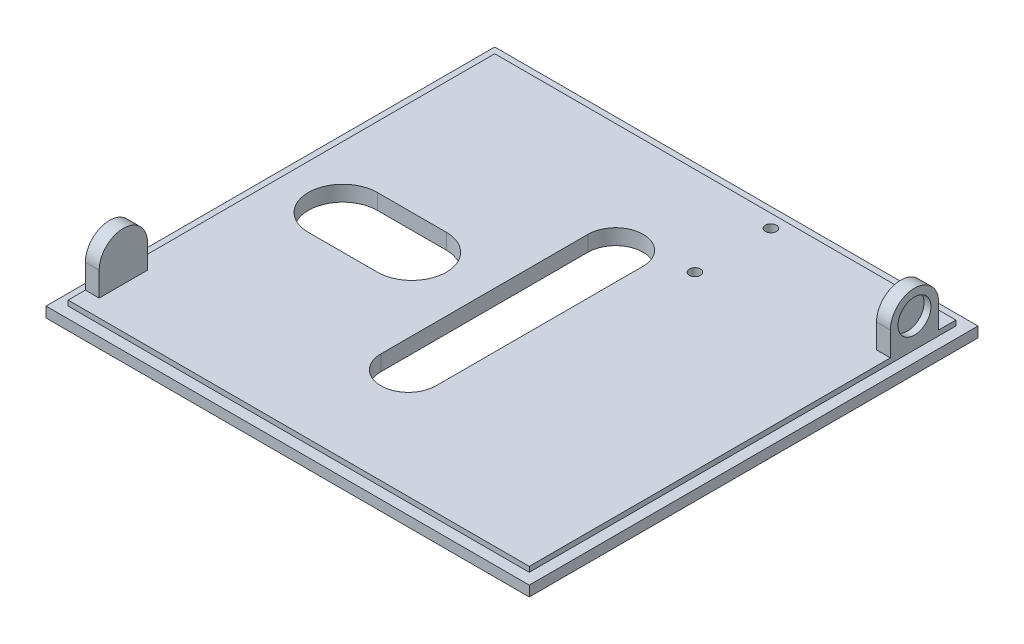
ISO-10303-21;
HEADER;
FILE_DESCRIPTION(('STEP AP214'),'2;1');
FILE_NAME('part.step','',(''),(''),'','','');
FILE_SCHEMA(('AUTOMOTIVE_DESIGN { 1 0 10303 214 1 1 1 1 }'));
ENDSEC;
DATA;
#1=APPLICATION_CONTEXT('core data for automotive mechanical design processes');
#2=APPLICATION_PROTOCOL_DEFINITION('international standard','automotive_design',2000,#1);
#3=PRODUCT_CONTEXT('',#1,'mechanical');
#4=PRODUCT('Part','Part','',(#3));
#5=PRODUCT_RELATED_PRODUCT_CATEGORY('part','',(#4));
#6=PRODUCT_DEFINITION_FORMATION('','',#4);
#7=PRODUCT_DEFINITION_CONTEXT('part definition',#1,'design');
#8=PRODUCT_DEFINITION('design','',#6,#7);
#9=PRODUCT_DEFINITION_SHAPE('','',#8);
#10=(LENGTH_UNIT() NAMED_UNIT(*) SI_UNIT(.MILLI.,.METRE.));
#11=(NAMED_UNIT(*) PLANE_ANGLE_UNIT() SI_UNIT($,.RADIAN.));
#12=(NAMED_UNIT(*) SI_UNIT($,.STERADIAN.) SOLID_ANGLE_UNIT());
#13=UNCERTAINTY_MEASURE_WITH_UNIT(LENGTH_MEASURE(1.E-05),#10,'distance_accuracy_value','');
#14=(GEOMETRIC_REPRESENTATION_CONTEXT(3) GLOBAL_UNCERTAINTY_ASSIGNED_CONTEXT((#13)) GLOBAL_UNIT_ASSIGNED_CONTEXT((#10,
#11,#12)) REPRESENTATION_CONTEXT('',''));
#15=CARTESIAN_POINT('',(0.,0.,0.));
#16=DIRECTION('',(0.,0.,1.));
#17=DIRECTION('',(1.,0.,0.));
#18=AXIS2_PLACEMENT_3D('',#15,#16,#17);
#19=CARTESIAN_POINT('',(62.8,11.5,-49.8));
#20=DIRECTION('',(-1.,0.,0.));
#21=DIRECTION('',(0.,0.,1.));
#22=AXIS2_PLACEMENT_3D('',#19,#20,#21);
#23=CYLINDRICAL_SURFACE('',#22,7.00000000000001);
#24=DIRECTION('',(1.,0.,0.));
#25=VECTOR('',#24,1.);
#26=CARTESIAN_POINT('',(62.8,11.5,-56.8));
#27=LINE('',#26,#25);
#28=CARTESIAN_POINT('',(62.8,11.5,-56.8));
#29=VERTEX_POINT('',#28);
#30=CARTESIAN_POINT('',(66.8,11.5,-56.8));
#31=VERTEX_POINT('',#30);
#32=EDGE_CURVE('E467',#29,#31,#27,.T.);
#33=ORIENTED_EDGE('',*,*,#32,.F.);
#34=CARTESIAN_POINT('',(62.8,11.5,-49.8));
#35=DIRECTION('',(1.,0.,0.));
#36=DIRECTION('',(0.,0.,-1.));
#37=AXIS2_PLACEMENT_3D('',#34,#35,#36);
#38=CIRCLE('',#37,7.00000000000001);
#39=CARTESIAN_POINT('',(62.8,11.5,-42.8));
#40=VERTEX_POINT('',#39);
#41=EDGE_CURVE('E55',#40,#29,#38,.F.);
#42=ORIENTED_EDGE('',*,*,#41,.F.);
#43=DIRECTION('',(1.,0.,0.));
#44=VECTOR('',#43,1.);
#45=CARTESIAN_POINT('',(62.8,11.5,-42.8));
#46=LINE('',#45,#44);
#47=CARTESIAN_POINT('',(66.8,11.5,-42.8));
#48=VERTEX_POINT('',#47);
#49=EDGE_CURVE('E471',#48,#40,#46,.F.);
#50=ORIENTED_EDGE('',*,*,#49,.F.);
#51=CARTESIAN_POINT('',(66.8,11.5,-49.8));
#52=DIRECTION('',(-1.,0.,0.));
#53=DIRECTION('',(0.,0.,1.));
#54=AXIS2_PLACEMENT_3D('',#51,#52,#53);
#55=CIRCLE('',#54,7.00000000000001);
#56=EDGE_CURVE('E11',#31,#48,#55,.F.);
#57=ORIENTED_EDGE('',*,*,#56,.F.);
#58=EDGE_LOOP('',(#33,#42,#50,#57));
#59=FACE_BOUND('',#58,.T.);
#60=ADVANCED_FACE('F46',(#59),#23,.T.);
#61=CARTESIAN_POINT('',(0.,4.5,0.));
#62=DIRECTION('',(0.,1.,0.));
#63=DIRECTION('',(0.,0.,1.));
#64=AXIS2_PLACEMENT_3D('',#61,#62,#63);
#65=PLANE('',#64);
#66=CARTESIAN_POINT('',(17.0000000000004,4.5,-35.9999999999998));
#67=DIRECTION('',(0.,1.,0.));
#68=DIRECTION('',(0.,0.,1.));
#69=AXIS2_PLACEMENT_3D('',#66,#67,#68);
#70=CIRCLE('',#69,1.60000000000001);
#71=CARTESIAN_POINT('',(17.0000000000004,4.5,-34.3999999999998));
#72=VERTEX_POINT('',#71);
#73=EDGE_CURVE('E849',#72,#72,#70,.T.);
#74=ORIENTED_EDGE('',*,*,#73,.F.);
#75=EDGE_LOOP('',(#74));
#76=FACE_BOUND('',#75,.T.);
#77=CARTESIAN_POINT('',(17.0000000000004,4.5,-57.9999999999998));
#78=DIRECTION('',(0.,1.,0.));
#79=DIRECTION('',(0.,0.,1.));
#80=AXIS2_PLACEMENT_3D('',#77,#78,#79);
#81=CIRCLE('',#80,1.60000000000001);
#82=CARTESIAN_POINT('',(17.0000000000004,4.5,-56.3999999999998));
#83=VERTEX_POINT('',#82);
#84=EDGE_CURVE('E854',#83,#83,#81,.T.);
#85=ORIENTED_EDGE('',*,*,#84,.F.);
#86=EDGE_LOOP('',(#85));
#87=FACE_BOUND('',#86,.T.);
#88=CARTESIAN_POINT('',(-49.,4.5,0.));
#89=DIRECTION('',(0.,1.,0.));
#90=DIRECTION('',(0.,0.,1.));
#91=AXIS2_PLACEMENT_3D('',#88,#89,#90);
#92=CIRCLE('',#91,10.);
#93=CARTESIAN_POINT('',(-49.,4.5,-10.));
#94=VERTEX_POINT('',#93);
#95=CARTESIAN_POINT('',(-49.,4.5,10.));
#96=VERTEX_POINT('',#95);
#97=EDGE_CURVE('E251',#94,#96,#92,.T.);
#98=ORIENTED_EDGE('',*,*,#97,.F.);
#99=DIRECTION('',(-1.,0.,0.));
#100=VECTOR('',#99,1.);
#101=CARTESIAN_POINT('',(0.,4.5,-9.99999999999999));
#102=LINE('',#101,#100);
#103=CARTESIAN_POINT('',(-29.,4.5,-10.));
#104=VERTEX_POINT('',#103);
#105=EDGE_CURVE('E238',#104,#94,#102,.T.);
#106=ORIENTED_EDGE('',*,*,#105,.F.);
#107=CARTESIAN_POINT('',(-29.,4.5,0.));
#108=DIRECTION('',(0.,1.,0.));
#109=DIRECTION('',(0.,0.,1.));
#110=AXIS2_PLACEMENT_3D('',#107,#108,#109);
#111=CIRCLE('',#110,10.);
#112=CARTESIAN_POINT('',(-29.,4.5,10.));
#113=VERTEX_POINT('',#112);
#114=EDGE_CURVE('E213',#113,#104,#111,.T.);
#115=ORIENTED_EDGE('',*,*,#114,.F.);
#116=DIRECTION('',(-1.,0.,0.));
#117=VECTOR('',#116,1.);
#118=CARTESIAN_POINT('',(0.,4.5,10.));
#119=LINE('',#118,#117);
#120=EDGE_CURVE('E247',#113,#96,#119,.T.);
#121=ORIENTED_EDGE('',*,*,#120,.T.);
#122=EDGE_LOOP('',(#98,#106,#115,#121));
#123=FACE_BOUND('',#122,.T.);
#124=CARTESIAN_POINT('',(0.,4.5,30.));
#125=DIRECTION('',(0.,1.,0.));
#126=DIRECTION('',(0.,0.,1.));
#127=AXIS2_PLACEMENT_3D('',#124,#125,#126);
#128=CIRCLE('',#127,8.);
#129=CARTESIAN_POINT('',(-8.,4.5,30.));
#130=VERTEX_POINT('',#129);
#131=CARTESIAN_POINT('',(8.,4.5,30.));
#132=VERTEX_POINT('',#131);
#133=EDGE_CURVE('E254',#130,#132,#128,.T.);
#134=ORIENTED_EDGE('',*,*,#133,.F.);
#135=DIRECTION('',(0.,0.,1.));
#136=VECTOR('',#135,1.);
#137=CARTESIAN_POINT('',(-8.,4.5,30.));
#138=LINE('',#137,#136);
#139=CARTESIAN_POINT('',(-8.00000000000001,4.5,-30.));
#140=VERTEX_POINT('',#139);
#141=EDGE_CURVE('E260',#140,#130,#138,.T.);
#142=ORIENTED_EDGE('',*,*,#141,.F.);
#143=CARTESIAN_POINT('',(0.,4.5,-30.));
#144=DIRECTION('',(0.,1.,0.));
#145=DIRECTION('',(0.,0.,1.));
#146=AXIS2_PLACEMENT_3D('',#143,#144,#145);
#147=CIRCLE('',#146,8.);
#148=CARTESIAN_POINT('',(7.99999999999999,4.5,-30.));
#149=VERTEX_POINT('',#148);
#150=EDGE_CURVE('E279',#149,#140,#147,.T.);
#151=ORIENTED_EDGE('',*,*,#150,.F.);
#152=DIRECTION('',(0.,0.,-1.));
#153=VECTOR('',#152,1.);
#154=CARTESIAN_POINT('',(8.,4.5,30.));
#155=LINE('',#154,#153);
#156=EDGE_CURVE('E275',#132,#149,#155,.T.);
#157=ORIENTED_EDGE('',*,*,#156,.F.);
#158=EDGE_LOOP('',(#134,#142,#151,#157));
#159=FACE_BOUND('',#158,.T.);
#160=DIRECTION('',(0.,0.,1.));
#161=VECTOR('',#160,1.);
#162=CARTESIAN_POINT('',(62.8,4.5,-42.8));
#163=LINE('',#162,#161);
#164=CARTESIAN_POINT('',(62.8,4.5,-56.8));
#165=VERTEX_POINT('',#164);
#166=CARTESIAN_POINT('',(62.8,4.5,-42.8));
#167=VERTEX_POINT('',#166);
#168=EDGE_CURVE('E310',#165,#167,#163,.T.);
#169=ORIENTED_EDGE('',*,*,#168,.F.);
#170=DIRECTION('',(-1.,0.,0.));
#171=VECTOR('',#170,1.);
#172=CARTESIAN_POINT('',(66.8,4.5,-56.8));
#173=LINE('',#172,#171);
#174=CARTESIAN_POINT('',(66.8,4.5,-56.8));
#175=VERTEX_POINT('',#174);
#176=EDGE_CURVE('E303',#175,#165,#173,.T.);
#177=ORIENTED_EDGE('',*,*,#176,.F.);
#178=DIRECTION('',(0.,0.,-1.));
#179=VECTOR('',#178,1.);
#180=CARTESIAN_POINT('',(66.8,4.5,61.8));
#181=LINE('',#180,#179);
#182=CARTESIAN_POINT('',(66.8,4.5,-61.8));
#183=VERTEX_POINT('',#182);
#184=EDGE_CURVE('E367',#175,#183,#181,.T.);
#185=ORIENTED_EDGE('',*,*,#184,.T.);
#186=DIRECTION('',(-1.,0.,0.));
#187=VECTOR('',#186,1.);
#188=CARTESIAN_POINT('',(66.8,4.5,-61.8));
#189=LINE('',#188,#187);
#190=CARTESIAN_POINT('',(-66.8,4.5,-61.8));
#191=VERTEX_POINT('',#190);
#192=EDGE_CURVE('E373',#183,#191,#189,.T.);
#193=ORIENTED_EDGE('',*,*,#192,.T.);
#194=DIRECTION('',(0.,0.,1.));
#195=VECTOR('',#194,1.);
#196=CARTESIAN_POINT('',(-66.8,4.5,-61.8));
#197=LINE('',#196,#195);
#198=CARTESIAN_POINT('',(-66.8,4.5,42.8));
#199=VERTEX_POINT('',#198);
#200=EDGE_CURVE('E377',#191,#199,#197,.T.);
#201=ORIENTED_EDGE('',*,*,#200,.T.);
#202=DIRECTION('',(-1.,0.,0.));
#203=VECTOR('',#202,1.);
#204=CARTESIAN_POINT('',(-66.8,4.5,42.8));
#205=LINE('',#204,#203);
#206=CARTESIAN_POINT('',(-62.8,4.5,42.8));
#207=VERTEX_POINT('',#206);
#208=EDGE_CURVE('E346',#207,#199,#205,.T.);
#209=ORIENTED_EDGE('',*,*,#208,.F.);
#210=DIRECTION('',(0.,0.,-1.));
#211=VECTOR('',#210,1.);
#212=CARTESIAN_POINT('',(-62.8,4.5,42.8));
#213=LINE('',#212,#211);
#214=CARTESIAN_POINT('',(-62.8,4.5,56.8));
#215=VERTEX_POINT('',#214);
#216=EDGE_CURVE('E342',#215,#207,#213,.T.);
#217=ORIENTED_EDGE('',*,*,#216,.F.);
#218=DIRECTION('',(1.,0.,0.));
#219=VECTOR('',#218,1.);
#220=CARTESIAN_POINT('',(-66.8,4.5,56.8));
#221=LINE('',#220,#219);
#222=CARTESIAN_POINT('',(-66.8,4.5,56.8));
#223=VERTEX_POINT('',#222);
#224=EDGE_CURVE('E335',#223,#215,#221,.T.);
#225=ORIENTED_EDGE('',*,*,#224,.F.);
#226=CARTESIAN_POINT('',(-66.8,4.5,61.8));
#227=VERTEX_POINT('',#226);
#228=EDGE_CURVE('E376',#223,#227,#197,.T.);
#229=ORIENTED_EDGE('',*,*,#228,.T.);
#230=DIRECTION('',(1.,0.,0.));
#231=VECTOR('',#230,1.);
#232=CARTESIAN_POINT('',(-66.8,4.5,61.8));
#233=LINE('',#232,#231);
#234=CARTESIAN_POINT('',(66.8,4.5,61.8));
#235=VERTEX_POINT('',#234);
#236=EDGE_CURVE('E363',#227,#235,#233,.T.);
#237=ORIENTED_EDGE('',*,*,#236,.T.);
#238=CARTESIAN_POINT('',(66.8,4.5,-42.8));
#239=VERTEX_POINT('',#238);
#240=EDGE_CURVE('E369',#235,#239,#181,.T.);
#241=ORIENTED_EDGE('',*,*,#240,.T.);
#242=DIRECTION('',(1.,0.,0.));
#243=VECTOR('',#242,1.);
#244=CARTESIAN_POINT('',(66.8,4.5,-42.8));
#245=LINE('',#244,#243);
#246=EDGE_CURVE('E314',#167,#239,#245,.T.);
#247=ORIENTED_EDGE('',*,*,#246,.F.);
#248=EDGE_LOOP('',(#169,#177,#185,#193,#201,#209,#217,#225,#229,#237,#241,#247));
#249=FACE_BOUND('',#248,.T.);
#250=ADVANCED_FACE('F490',(#76,#87,#123,#159,#249),#65,.T.);
#251=CARTESIAN_POINT('',(-62.8,11.5,49.8));
#252=DIRECTION('',(1.,0.,0.));
#253=DIRECTION('',(0.,0.,-1.));
#254=AXIS2_PLACEMENT_3D('',#251,#252,#253);
#255=CYLINDRICAL_SURFACE('',#254,7.00000000000001);
#256=DIRECTION('',(-1.,0.,0.));
#257=VECTOR('',#256,1.);
#258=CARTESIAN_POINT('',(-62.8,11.5,56.8));
#259=LINE('',#258,#257);
#260=CARTESIAN_POINT('',(-62.8,11.5,56.8));
#261=VERTEX_POINT('',#260);
#262=CARTESIAN_POINT('',(-66.8,11.5,56.8));
#263=VERTEX_POINT('',#262);
#264=EDGE_CURVE('E453',#261,#263,#259,.T.);
#265=ORIENTED_EDGE('',*,*,#264,.F.);
#266=CARTESIAN_POINT('',(-62.8,11.5,49.8));
#267=DIRECTION('',(-1.,0.,0.));
#268=DIRECTION('',(0.,0.,1.));
#269=AXIS2_PLACEMENT_3D('',#266,#267,#268);
#270=CIRCLE('',#269,7.00000000000001);
#271=CARTESIAN_POINT('',(-62.8,11.5,42.8));
#272=VERTEX_POINT('',#271);
#273=EDGE_CURVE('E461',#272,#261,#270,.F.);
#274=ORIENTED_EDGE('',*,*,#273,.F.);
#275=DIRECTION('',(-1.,0.,0.));
#276=VECTOR('',#275,1.);
#277=CARTESIAN_POINT('',(-62.8,11.5,42.8));
#278=LINE('',#277,#276);
#279=CARTESIAN_POINT('',(-66.8,11.5,42.8));
#280=VERTEX_POINT('',#279);
#281=EDGE_CURVE('E457',#280,#272,#278,.F.);
#282=ORIENTED_EDGE('',*,*,#281,.F.);
#283=CARTESIAN_POINT('',(-66.8,11.5,49.8));
#284=DIRECTION('',(1.,0.,0.));
#285=DIRECTION('',(0.,0.,-1.));
#286=AXIS2_PLACEMENT_3D('',#283,#284,#285);
#287=CIRCLE('',#286,7.00000000000001);
#288=EDGE_CURVE('E464',#263,#280,#287,.F.);
#289=ORIENTED_EDGE('',*,*,#288,.F.);
#290=EDGE_LOOP('',(#265,#274,#282,#289));
#291=FACE_BOUND('',#290,.T.);
#292=ADVANCED_FACE('F529',(#291),#255,.T.);
#293=CARTESIAN_POINT('',(70.,3.,-65.));
#294=DIRECTION('',(-1.,0.,0.));
#295=DIRECTION('',(0.,0.,1.));
#296=AXIS2_PLACEMENT_3D('',#293,#294,#295);
#297=PLANE('',#296);
#298=DIRECTION('',(0.,0.,-1.));
#299=VECTOR('',#298,1.);
#300=CARTESIAN_POINT('',(70.,0.,-65.));
#301=LINE('',#300,#299);
#302=CARTESIAN_POINT('',(70.,0.,65.));
#303=VERTEX_POINT('',#302);
#304=CARTESIAN_POINT('',(70.,0.,-65.));
#305=VERTEX_POINT('',#304);
#306=EDGE_CURVE('E411',#303,#305,#301,.T.);
#307=ORIENTED_EDGE('',*,*,#306,.T.);
#308=DIRECTION('',(0.,-1.,0.));
#309=VECTOR('',#308,1.);
#310=CARTESIAN_POINT('',(70.,3.,-65.));
#311=LINE('',#310,#309);
#312=CARTESIAN_POINT('',(70.,3.,-65.));
#313=VERTEX_POINT('',#312);
#314=EDGE_CURVE('E449',#313,#305,#311,.T.);
#315=ORIENTED_EDGE('',*,*,#314,.F.);
#316=DIRECTION('',(0.,0.,-1.));
#317=VECTOR('',#316,1.);
#318=CARTESIAN_POINT('',(70.,3.,-65.));
#319=LINE('',#318,#317);
#320=CARTESIAN_POINT('',(70.,3.,65.));
#321=VERTEX_POINT('',#320);
#322=EDGE_CURVE('E412',#321,#313,#319,.T.);
#323=ORIENTED_EDGE('',*,*,#322,.F.);
#324=DIRECTION('',(0.,-1.,0.));
#325=VECTOR('',#324,1.);
#326=CARTESIAN_POINT('',(70.,3.,65.));
#327=LINE('',#326,#325);
#328=EDGE_CURVE('E426',#321,#303,#327,.T.);
#329=ORIENTED_EDGE('',*,*,#328,.T.);
#330=EDGE_LOOP('',(#307,#315,#323,#329));
#331=FACE_BOUND('',#330,.T.);
#332=ADVANCED_FACE('F531',(#331),#297,.F.);
#333=CARTESIAN_POINT('',(-70.,3.,-65.));
#334=DIRECTION('',(0.,0.,1.));
#335=DIRECTION('',(1.,0.,0.));
#336=AXIS2_PLACEMENT_3D('',#333,#334,#335);
#337=PLANE('',#336);
#338=DIRECTION('',(-1.,0.,0.));
#339=VECTOR('',#338,1.);
#340=CARTESIAN_POINT('',(-70.,0.,-65.));
#341=LINE('',#340,#339);
#342=CARTESIAN_POINT('',(-70.,0.,-65.));
#343=VERTEX_POINT('',#342);
#344=EDGE_CURVE('E430',#305,#343,#341,.T.);
#345=ORIENTED_EDGE('',*,*,#344,.T.);
#346=DIRECTION('',(0.,-1.,0.));
#347=VECTOR('',#346,1.);
#348=CARTESIAN_POINT('',(-70.,3.,-65.));
#349=LINE('',#348,#347);
#350=CARTESIAN_POINT('',(-70.,3.,-65.));
#351=VERTEX_POINT('',#350);
#352=EDGE_CURVE('E445',#351,#343,#349,.T.);
#353=ORIENTED_EDGE('',*,*,#352,.F.);
#354=DIRECTION('',(-1.,0.,0.));
#355=VECTOR('',#354,1.);
#356=CARTESIAN_POINT('',(-70.,3.,-65.));
#357=LINE('',#356,#355);
#358=EDGE_CURVE('E416',#313,#351,#357,.T.);
#359=ORIENTED_EDGE('',*,*,#358,.F.);
#360=ORIENTED_EDGE('',*,*,#314,.T.);
#361=EDGE_LOOP('',(#345,#353,#359,#360));
#362=FACE_BOUND('',#361,.T.);
#363=ADVANCED_FACE('F537',(#362),#337,.F.);
#364=CARTESIAN_POINT('',(-70.,3.,-65.));
#365=DIRECTION('',(1.,0.,0.));
#366=DIRECTION('',(0.,0.,-1.));
#367=AXIS2_PLACEMENT_3D('',#364,#365,#366);
#368=PLANE('',#367);
#369=DIRECTION('',(0.,0.,1.));
#370=VECTOR('',#369,1.);
#371=CARTESIAN_POINT('',(-70.,0.,-65.));
#372=LINE('',#371,#370);
#373=CARTESIAN_POINT('',(-70.,0.,65.));
#374=VERTEX_POINT('',#373);
#375=EDGE_CURVE('E433',#343,#374,#372,.T.);
#376=ORIENTED_EDGE('',*,*,#375,.T.);
#377=DIRECTION('',(0.,-1.,0.));
#378=VECTOR('',#377,1.);
#379=CARTESIAN_POINT('',(-70.,3.,65.));
#380=LINE('',#379,#378);
#381=CARTESIAN_POINT('',(-70.,3.,65.));
#382=VERTEX_POINT('',#381);
#383=EDGE_CURVE('E441',#382,#374,#380,.T.);
#384=ORIENTED_EDGE('',*,*,#383,.F.);
#385=DIRECTION('',(0.,0.,1.));
#386=VECTOR('',#385,1.);
#387=CARTESIAN_POINT('',(-70.,3.,-65.));
#388=LINE('',#387,#386);
#389=EDGE_CURVE('E420',#351,#382,#388,.T.);
#390=ORIENTED_EDGE('',*,*,#389,.F.);
#391=ORIENTED_EDGE('',*,*,#352,.T.);
#392=EDGE_LOOP('',(#376,#384,#390,#391));
#393=FACE_BOUND('',#392,.T.);
#394=ADVANCED_FACE('F741',(#393),#368,.F.);
#395=CARTESIAN_POINT('',(-70.,3.,65.));
#396=DIRECTION('',(0.,0.,-1.));
#397=DIRECTION('',(-1.,0.,0.));
#398=AXIS2_PLACEMENT_3D('',#395,#396,#397);
#399=PLANE('',#398);
#400=DIRECTION('',(1.,0.,0.));
#401=VECTOR('',#400,1.);
#402=CARTESIAN_POINT('',(-70.,0.,65.));
#403=LINE('',#402,#401);
#404=EDGE_CURVE('E417',#374,#303,#403,.T.);
#405=ORIENTED_EDGE('',*,*,#404,.T.);
#406=ORIENTED_EDGE('',*,*,#328,.F.);
#407=DIRECTION('',(1.,0.,0.));
#408=VECTOR('',#407,1.);
#409=CARTESIAN_POINT('',(-70.,3.,65.));
#410=LINE('',#409,#408);
#411=EDGE_CURVE('E423',#382,#321,#410,.T.);
#412=ORIENTED_EDGE('',*,*,#411,.F.);
#413=ORIENTED_EDGE('',*,*,#383,.T.);
#414=EDGE_LOOP('',(#405,#406,#412,#413));
#415=FACE_BOUND('',#414,.T.);
#416=ADVANCED_FACE('F737',(#415),#399,.F.);
#417=CARTESIAN_POINT('',(0.,3.,0.));
#418=DIRECTION('',(0.,1.,0.));
#419=DIRECTION('',(0.,0.,1.));
#420=AXIS2_PLACEMENT_3D('',#417,#418,#419);
#421=PLANE('',#420);
#422=DIRECTION('',(1.,0.,0.));
#423=VECTOR('',#422,1.);
#424=CARTESIAN_POINT('',(-66.8,3.,61.8));
#425=LINE('',#424,#423);
#426=CARTESIAN_POINT('',(-66.8,3.,61.8));
#427=VERTEX_POINT('',#426);
#428=CARTESIAN_POINT('',(66.8,3.,61.8));
#429=VERTEX_POINT('',#428);
#430=EDGE_CURVE('E362',#427,#429,#425,.T.);
#431=ORIENTED_EDGE('',*,*,#430,.F.);
#432=DIRECTION('',(0.,0.,1.));
#433=VECTOR('',#432,1.);
#434=CARTESIAN_POINT('',(-66.8,3.,-61.8));
#435=LINE('',#434,#433);
#436=CARTESIAN_POINT('',(-66.8,3.,-61.8));
#437=VERTEX_POINT('',#436);
#438=EDGE_CURVE('E368',#437,#427,#435,.T.);
#439=ORIENTED_EDGE('',*,*,#438,.F.);
#440=DIRECTION('',(-1.,0.,0.));
#441=VECTOR('',#440,1.);
#442=CARTESIAN_POINT('',(66.8,3.,-61.8));
#443=LINE('',#442,#441);
#444=CARTESIAN_POINT('',(66.8,3.,-61.8));
#445=VERTEX_POINT('',#444);
#446=EDGE_CURVE('E389',#445,#437,#443,.T.);
#447=ORIENTED_EDGE('',*,*,#446,.F.);
#448=DIRECTION('',(0.,0.,-1.));
#449=VECTOR('',#448,1.);
#450=CARTESIAN_POINT('',(66.8,3.,61.8));
#451=LINE('',#450,#449);
#452=EDGE_CURVE('E385',#429,#445,#451,.T.);
#453=ORIENTED_EDGE('',*,*,#452,.F.);
#454=EDGE_LOOP('',(#431,#439,#447,#453));
#455=FACE_BOUND('',#454,.T.);
#456=ORIENTED_EDGE('',*,*,#322,.T.);
#457=ORIENTED_EDGE('',*,*,#358,.T.);
#458=ORIENTED_EDGE('',*,*,#389,.T.);
#459=ORIENTED_EDGE('',*,*,#411,.T.);
#460=EDGE_LOOP('',(#456,#457,#458,#459));
#461=FACE_BOUND('',#460,.T.);
#462=ADVANCED_FACE('F679',(#455,#461),#421,.T.);
#463=CARTESIAN_POINT('',(0.,0.,0.));
#464=DIRECTION('',(0.,1.,0.));
#465=DIRECTION('',(0.,0.,1.));
#466=AXIS2_PLACEMENT_3D('',#463,#464,#465);
#467=PLANE('',#466);
#468=CARTESIAN_POINT('',(17.0000000000004,0.,-35.9999999999998));
#469=DIRECTION('',(0.,-1.,0.));
#470=DIRECTION('',(0.,0.,-1.));
#471=AXIS2_PLACEMENT_3D('',#468,#469,#470);
#472=CIRCLE('',#471,1.60000000000001);
#473=CARTESIAN_POINT('',(17.0000000000004,0.,-37.5999999999998));
#474=VERTEX_POINT('',#473);
#475=EDGE_CURVE('E852',#474,#474,#472,.T.);
#476=ORIENTED_EDGE('',*,*,#475,.F.);
#477=EDGE_LOOP('',(#476));
#478=FACE_BOUND('',#477,.T.);
#479=CARTESIAN_POINT('',(17.0000000000004,0.,-57.9999999999998));
#480=DIRECTION('',(0.,-1.,0.));
#481=DIRECTION('',(0.,0.,-1.));
#482=AXIS2_PLACEMENT_3D('',#479,#480,#481);
#483=CIRCLE('',#482,1.60000000000001);
#484=CARTESIAN_POINT('',(17.0000000000004,0.,-59.5999999999998));
#485=VERTEX_POINT('',#484);
#486=EDGE_CURVE('E855',#485,#485,#483,.T.);
#487=ORIENTED_EDGE('',*,*,#486,.F.);
#488=EDGE_LOOP('',(#487));
#489=FACE_BOUND('',#488,.T.);
#490=DIRECTION('',(1.,0.,0.));
#491=VECTOR('',#490,1.);
#492=CARTESIAN_POINT('',(-49.,0.,-10.));
#493=LINE('',#492,#491);
#494=CARTESIAN_POINT('',(-49.,0.,-10.));
#495=VERTEX_POINT('',#494);
#496=CARTESIAN_POINT('',(-29.,0.,-10.));
#497=VERTEX_POINT('',#496);
#498=EDGE_CURVE('E220',#495,#497,#493,.T.);
#499=ORIENTED_EDGE('',*,*,#498,.F.);
#500=CARTESIAN_POINT('',(-49.,0.,0.));
#501=DIRECTION('',(0.,-1.,0.));
#502=DIRECTION('',(0.,0.,-1.));
#503=AXIS2_PLACEMENT_3D('',#500,#501,#502);
#504=CIRCLE('',#503,10.);
#505=CARTESIAN_POINT('',(-49.,0.,10.));
#506=VERTEX_POINT('',#505);
#507=EDGE_CURVE('E70',#506,#495,#504,.T.);
#508=ORIENTED_EDGE('',*,*,#507,.F.);
#509=DIRECTION('',(1.,0.,0.));
#510=VECTOR('',#509,1.);
#511=CARTESIAN_POINT('',(-49.,0.,10.));
#512=LINE('',#511,#510);
#513=CARTESIAN_POINT('',(-29.,0.,10.));
#514=VERTEX_POINT('',#513);
#515=EDGE_CURVE('E228',#506,#514,#512,.T.);
#516=ORIENTED_EDGE('',*,*,#515,.T.);
#517=CARTESIAN_POINT('',(-29.,0.,0.));
#518=DIRECTION('',(0.,-1.,0.));
#519=DIRECTION('',(0.,0.,-1.));
#520=AXIS2_PLACEMENT_3D('',#517,#518,#519);
#521=CIRCLE('',#520,10.);
#522=EDGE_CURVE('E210',#497,#514,#521,.T.);
#523=ORIENTED_EDGE('',*,*,#522,.F.);
#524=EDGE_LOOP('',(#499,#508,#516,#523));
#525=FACE_BOUND('',#524,.T.);
#526=DIRECTION('',(0.,0.,1.));
#527=VECTOR('',#526,1.);
#528=CARTESIAN_POINT('',(-8.,0.,30.));
#529=LINE('',#528,#527);
#530=CARTESIAN_POINT('',(-8.00000000000001,0.,-30.));
#531=VERTEX_POINT('',#530);
#532=CARTESIAN_POINT('',(-8.,0.,30.));
#533=VERTEX_POINT('',#532);
#534=EDGE_CURVE('E268',#531,#533,#529,.T.);
#535=ORIENTED_EDGE('',*,*,#534,.T.);
#536=CARTESIAN_POINT('',(0.,0.,30.));
#537=DIRECTION('',(0.,1.,0.));
#538=DIRECTION('',(0.,0.,1.));
#539=AXIS2_PLACEMENT_3D('',#536,#537,#538);
#540=CIRCLE('',#539,8.);
#541=CARTESIAN_POINT('',(8.,0.,30.));
#542=VERTEX_POINT('',#541);
#543=EDGE_CURVE('E255',#533,#542,#540,.T.);
#544=ORIENTED_EDGE('',*,*,#543,.T.);
#545=DIRECTION('',(0.,0.,-1.));
#546=VECTOR('',#545,1.);
#547=CARTESIAN_POINT('',(8.,0.,30.));
#548=LINE('',#547,#546);
#549=CARTESIAN_POINT('',(7.99999999999999,0.,-30.));
#550=VERTEX_POINT('',#549);
#551=EDGE_CURVE('E259',#542,#550,#548,.T.);
#552=ORIENTED_EDGE('',*,*,#551,.T.);
#553=CARTESIAN_POINT('',(0.,0.,-30.));
#554=DIRECTION('',(0.,1.,0.));
#555=DIRECTION('',(0.,0.,1.));
#556=AXIS2_PLACEMENT_3D('',#553,#554,#555);
#557=CIRCLE('',#556,8.);
#558=EDGE_CURVE('E264',#550,#531,#557,.T.);
#559=ORIENTED_EDGE('',*,*,#558,.T.);
#560=EDGE_LOOP('',(#535,#544,#552,#559));
#561=FACE_BOUND('',#560,.T.);
#562=ORIENTED_EDGE('',*,*,#306,.F.);
#563=ORIENTED_EDGE('',*,*,#404,.F.);
#564=ORIENTED_EDGE('',*,*,#375,.F.);
#565=ORIENTED_EDGE('',*,*,#344,.F.);
#566=EDGE_LOOP('',(#562,#563,#564,#565));
#567=FACE_BOUND('',#566,.T.);
#568=ADVANCED_FACE('F225',(#478,#489,#525,#561,#567),#467,.F.);
#569=CARTESIAN_POINT('',(-66.8,4.5,61.8));
#570=DIRECTION('',(0.,0.,-1.));
#571=DIRECTION('',(-1.,0.,0.));
#572=AXIS2_PLACEMENT_3D('',#569,#570,#571);
#573=PLANE('',#572);
#574=ORIENTED_EDGE('',*,*,#430,.T.);
#575=DIRECTION('',(0.,-1.,0.));
#576=VECTOR('',#575,1.);
#577=CARTESIAN_POINT('',(66.8,4.5,61.8));
#578=LINE('',#577,#576);
#579=EDGE_CURVE('E407',#235,#429,#578,.T.);
#580=ORIENTED_EDGE('',*,*,#579,.F.);
#581=ORIENTED_EDGE('',*,*,#236,.F.);
#582=DIRECTION('',(0.,-1.,0.));
#583=VECTOR('',#582,1.);
#584=CARTESIAN_POINT('',(-66.8,4.5,61.8));
#585=LINE('',#584,#583);
#586=EDGE_CURVE('E381',#227,#427,#585,.T.);
#587=ORIENTED_EDGE('',*,*,#586,.T.);
#588=EDGE_LOOP('',(#574,#580,#581,#587));
#589=FACE_BOUND('',#588,.T.);
#590=ADVANCED_FACE('F510',(#589),#573,.F.);
#591=CARTESIAN_POINT('',(66.8,4.5,61.8));
#592=DIRECTION('',(-1.,0.,0.));
#593=DIRECTION('',(0.,0.,1.));
#594=AXIS2_PLACEMENT_3D('',#591,#592,#593);
#595=PLANE('',#594);
#596=CARTESIAN_POINT('',(66.8,11.5,-49.8));
#597=DIRECTION('',(1.,0.,0.));
#598=DIRECTION('',(0.,0.,-1.));
#599=AXIS2_PLACEMENT_3D('',#596,#597,#598);
#600=CIRCLE('',#599,4.775);
#601=CARTESIAN_POINT('',(66.8,11.5,-54.575));
#602=VERTEX_POINT('',#601);
#603=EDGE_CURVE('E289',#602,#602,#600,.T.);
#604=ORIENTED_EDGE('',*,*,#603,.F.);
#605=EDGE_LOOP('',(#604));
#606=FACE_BOUND('',#605,.T.);
#607=DIRECTION('',(0.,-1.,0.));
#608=VECTOR('',#607,1.);
#609=CARTESIAN_POINT('',(66.8,18.5,-56.8));
#610=LINE('',#609,#608);
#611=EDGE_CURVE('E327',#31,#175,#610,.T.);
#612=ORIENTED_EDGE('',*,*,#611,.F.);
#613=ORIENTED_EDGE('',*,*,#56,.T.);
#614=DIRECTION('',(0.,-1.,0.));
#615=VECTOR('',#614,1.);
#616=CARTESIAN_POINT('',(66.8,18.5,-42.8));
#617=LINE('',#616,#615);
#618=EDGE_CURVE('E318',#48,#239,#617,.T.);
#619=ORIENTED_EDGE('',*,*,#618,.T.);
#620=ORIENTED_EDGE('',*,*,#240,.F.);
#621=ORIENTED_EDGE('',*,*,#579,.T.);
#622=ORIENTED_EDGE('',*,*,#452,.T.);
#623=DIRECTION('',(0.,-1.,0.));
#624=VECTOR('',#623,1.);
#625=CARTESIAN_POINT('',(66.8,4.5,-61.8));
#626=LINE('',#625,#624);
#627=EDGE_CURVE('E403',#183,#445,#626,.T.);
#628=ORIENTED_EDGE('',*,*,#627,.F.);
#629=ORIENTED_EDGE('',*,*,#184,.F.);
#630=EDGE_LOOP('',(#612,#613,#619,#620,#621,#622,#628,#629));
#631=FACE_BOUND('',#630,.T.);
#632=ADVANCED_FACE('F495',(#606,#631),#595,.F.);
#633=CARTESIAN_POINT('',(66.8,4.5,-61.8));
#634=DIRECTION('',(0.,0.,1.));
#635=DIRECTION('',(1.,0.,0.));
#636=AXIS2_PLACEMENT_3D('',#633,#634,#635);
#637=PLANE('',#636);
#638=ORIENTED_EDGE('',*,*,#446,.T.);
#639=DIRECTION('',(0.,-1.,0.));
#640=VECTOR('',#639,1.);
#641=CARTESIAN_POINT('',(-66.8,4.5,-61.8));
#642=LINE('',#641,#640);
#643=EDGE_CURVE('E399',#191,#437,#642,.T.);
#644=ORIENTED_EDGE('',*,*,#643,.F.);
#645=ORIENTED_EDGE('',*,*,#192,.F.);
#646=ORIENTED_EDGE('',*,*,#627,.T.);
#647=EDGE_LOOP('',(#638,#644,#645,#646));
#648=FACE_BOUND('',#647,.T.);
#649=ADVANCED_FACE('F513',(#648),#637,.F.);
#650=CARTESIAN_POINT('',(-66.8,4.5,-61.8));
#651=DIRECTION('',(1.,0.,0.));
#652=DIRECTION('',(0.,0.,-1.));
#653=AXIS2_PLACEMENT_3D('',#650,#651,#652);
#654=PLANE('',#653);
#655=CARTESIAN_POINT('',(-66.8,11.5,49.8));
#656=DIRECTION('',(-1.,0.,0.));
#657=DIRECTION('',(0.,0.,1.));
#658=AXIS2_PLACEMENT_3D('',#655,#656,#657);
#659=CIRCLE('',#658,4.775);
#660=CARTESIAN_POINT('',(-66.8,11.5,54.575));
#661=VERTEX_POINT('',#660);
#662=EDGE_CURVE('E330',#661,#661,#659,.T.);
#663=ORIENTED_EDGE('',*,*,#662,.F.);
#664=EDGE_LOOP('',(#663));
#665=FACE_BOUND('',#664,.T.);
#666=DIRECTION('',(0.,-1.,0.));
#667=VECTOR('',#666,1.);
#668=CARTESIAN_POINT('',(-66.8,18.5,56.8));
#669=LINE('',#668,#667);
#670=EDGE_CURVE('E359',#263,#223,#669,.T.);
#671=ORIENTED_EDGE('',*,*,#670,.F.);
#672=ORIENTED_EDGE('',*,*,#288,.T.);
#673=DIRECTION('',(0.,-1.,0.));
#674=VECTOR('',#673,1.);
#675=CARTESIAN_POINT('',(-66.8,18.5,42.8));
#676=LINE('',#675,#674);
#677=EDGE_CURVE('E350',#280,#199,#676,.T.);
#678=ORIENTED_EDGE('',*,*,#677,.T.);
#679=ORIENTED_EDGE('',*,*,#200,.F.);
#680=ORIENTED_EDGE('',*,*,#643,.T.);
#681=ORIENTED_EDGE('',*,*,#438,.T.);
#682=ORIENTED_EDGE('',*,*,#586,.F.);
#683=ORIENTED_EDGE('',*,*,#228,.F.);
#684=EDGE_LOOP('',(#671,#672,#678,#679,#680,#681,#682,#683));
#685=FACE_BOUND('',#684,.T.);
#686=ADVANCED_FACE('F508',(#665,#685),#654,.F.);
#687=CARTESIAN_POINT('',(-66.8,18.5,56.8));
#688=DIRECTION('',(0.,0.,-1.));
#689=DIRECTION('',(-1.,0.,0.));
#690=AXIS2_PLACEMENT_3D('',#687,#688,#689);
#691=PLANE('',#690);
#692=DIRECTION('',(0.,-1.,0.));
#693=VECTOR('',#692,1.);
#694=CARTESIAN_POINT('',(-62.8,18.5,56.8));
#695=LINE('',#694,#693);
#696=EDGE_CURVE('E356',#261,#215,#695,.T.);
#697=ORIENTED_EDGE('',*,*,#696,.F.);
#698=ORIENTED_EDGE('',*,*,#264,.T.);
#699=ORIENTED_EDGE('',*,*,#670,.T.);
#700=ORIENTED_EDGE('',*,*,#224,.T.);
#701=EDGE_LOOP('',(#697,#698,#699,#700));
#702=FACE_BOUND('',#701,.T.);
#703=ADVANCED_FACE('F527',(#702),#691,.F.);
#704=CARTESIAN_POINT('',(-62.8,18.5,42.8));
#705=DIRECTION('',(-1.,0.,0.));
#706=DIRECTION('',(0.,0.,1.));
#707=AXIS2_PLACEMENT_3D('',#704,#705,#706);
#708=PLANE('',#707);
#709=DIRECTION('',(0.,-1.,0.));
#710=VECTOR('',#709,1.);
#711=CARTESIAN_POINT('',(-62.8,18.5,42.8));
#712=LINE('',#711,#710);
#713=EDGE_CURVE('E353',#272,#207,#712,.T.);
#714=ORIENTED_EDGE('',*,*,#713,.F.);
#715=ORIENTED_EDGE('',*,*,#273,.T.);
#716=ORIENTED_EDGE('',*,*,#696,.T.);
#717=ORIENTED_EDGE('',*,*,#216,.T.);
#718=EDGE_LOOP('',(#714,#715,#716,#717));
#719=FACE_BOUND('',#718,.T.);
#720=ADVANCED_FACE('F523',(#719),#708,.F.);
#721=CARTESIAN_POINT('',(-66.8,18.5,42.8));
#722=DIRECTION('',(0.,0.,1.));
#723=DIRECTION('',(1.,0.,0.));
#724=AXIS2_PLACEMENT_3D('',#721,#722,#723);
#725=PLANE('',#724);
#726=ORIENTED_EDGE('',*,*,#677,.F.);
#727=ORIENTED_EDGE('',*,*,#281,.T.);
#728=ORIENTED_EDGE('',*,*,#713,.T.);
#729=ORIENTED_EDGE('',*,*,#208,.T.);
#730=EDGE_LOOP('',(#726,#727,#728,#729));
#731=FACE_BOUND('',#730,.T.);
#732=ADVANCED_FACE('F519',(#731),#725,.F.);
#733=CARTESIAN_POINT('',(-64.8,11.5,49.8));
#734=DIRECTION('',(-1.,0.,0.));
#735=DIRECTION('',(0.,0.,1.));
#736=AXIS2_PLACEMENT_3D('',#733,#734,#735);
#737=CYLINDRICAL_SURFACE('',#736,4.775);
#738=CARTESIAN_POINT('',(-64.8,11.5,49.8));
#739=DIRECTION('',(-1.,0.,0.));
#740=DIRECTION('',(0.,0.,1.));
#741=AXIS2_PLACEMENT_3D('',#738,#739,#740);
#742=CIRCLE('',#741,4.775);
#743=CARTESIAN_POINT('',(-64.8,11.5,54.575));
#744=VERTEX_POINT('',#743);
#745=EDGE_CURVE('E331',#744,#744,#742,.T.);
#746=ORIENTED_EDGE('',*,*,#745,.F.);
#747=EDGE_LOOP('',(#746));
#748=FACE_BOUND('',#747,.T.);
#749=ORIENTED_EDGE('',*,*,#662,.T.);
#750=EDGE_LOOP('',(#749));
#751=FACE_BOUND('',#750,.T.);
#752=ADVANCED_FACE('F721',(#748,#751),#737,.F.);
#753=CARTESIAN_POINT('',(-64.8,11.5,49.8));
#754=DIRECTION('',(-1.,0.,0.));
#755=DIRECTION('',(0.,0.,1.));
#756=AXIS2_PLACEMENT_3D('',#753,#754,#755);
#757=PLANE('',#756);
#758=ORIENTED_EDGE('',*,*,#745,.T.);
#759=EDGE_LOOP('',(#758));
#760=FACE_BOUND('',#759,.T.);
#761=ADVANCED_FACE('F568',(#760),#757,.T.);
#762=CARTESIAN_POINT('',(66.8,18.5,-56.8));
#763=DIRECTION('',(0.,0.,1.));
#764=DIRECTION('',(1.,0.,0.));
#765=AXIS2_PLACEMENT_3D('',#762,#763,#764);
#766=PLANE('',#765);
#767=DIRECTION('',(0.,-1.,0.));
#768=VECTOR('',#767,1.);
#769=CARTESIAN_POINT('',(62.8,18.5,-56.8));
#770=LINE('',#769,#768);
#771=EDGE_CURVE('E324',#29,#165,#770,.T.);
#772=ORIENTED_EDGE('',*,*,#771,.F.);
#773=ORIENTED_EDGE('',*,*,#32,.T.);
#774=ORIENTED_EDGE('',*,*,#611,.T.);
#775=ORIENTED_EDGE('',*,*,#176,.T.);
#776=EDGE_LOOP('',(#772,#773,#774,#775));
#777=FACE_BOUND('',#776,.T.);
#778=ADVANCED_FACE('F484',(#777),#766,.F.);
#779=CARTESIAN_POINT('',(62.8,18.5,-42.8));
#780=DIRECTION('',(1.,0.,0.));
#781=DIRECTION('',(0.,0.,-1.));
#782=AXIS2_PLACEMENT_3D('',#779,#780,#781);
#783=PLANE('',#782);
#784=DIRECTION('',(0.,-1.,0.));
#785=VECTOR('',#784,1.);
#786=CARTESIAN_POINT('',(62.8,18.5,-42.8));
#787=LINE('',#786,#785);
#788=EDGE_CURVE('E321',#40,#167,#787,.T.);
#789=ORIENTED_EDGE('',*,*,#788,.F.);
#790=ORIENTED_EDGE('',*,*,#41,.T.);
#791=ORIENTED_EDGE('',*,*,#771,.T.);
#792=ORIENTED_EDGE('',*,*,#168,.T.);
#793=EDGE_LOOP('',(#789,#790,#791,#792));
#794=FACE_BOUND('',#793,.T.);
#795=ADVANCED_FACE('F478',(#794),#783,.F.);
#796=CARTESIAN_POINT('',(66.8,18.5,-42.8));
#797=DIRECTION('',(0.,0.,-1.));
#798=DIRECTION('',(-1.,0.,0.));
#799=AXIS2_PLACEMENT_3D('',#796,#797,#798);
#800=PLANE('',#799);
#801=ORIENTED_EDGE('',*,*,#618,.F.);
#802=ORIENTED_EDGE('',*,*,#49,.T.);
#803=ORIENTED_EDGE('',*,*,#788,.T.);
#804=ORIENTED_EDGE('',*,*,#246,.T.);
#805=EDGE_LOOP('',(#801,#802,#803,#804));
#806=FACE_BOUND('',#805,.T.);
#807=ADVANCED_FACE('F493',(#806),#800,.F.);
#808=CARTESIAN_POINT('',(64.8,11.5,-49.8));
#809=DIRECTION('',(1.,0.,0.));
#810=DIRECTION('',(0.,0.,-1.));
#811=AXIS2_PLACEMENT_3D('',#808,#809,#810);
#812=CYLINDRICAL_SURFACE('',#811,4.775);
#813=CARTESIAN_POINT('',(64.8,11.5,-49.8));
#814=DIRECTION('',(1.,0.,0.));
#815=DIRECTION('',(0.,0.,-1.));
#816=AXIS2_PLACEMENT_3D('',#813,#814,#815);
#817=CIRCLE('',#816,4.775);
#818=CARTESIAN_POINT('',(64.8,11.5,-54.575));
#819=VERTEX_POINT('',#818);
#820=EDGE_CURVE('E299',#819,#819,#817,.T.);
#821=ORIENTED_EDGE('',*,*,#820,.F.);
#822=EDGE_LOOP('',(#821));
#823=FACE_BOUND('',#822,.T.);
#824=ORIENTED_EDGE('',*,*,#603,.T.);
#825=EDGE_LOOP('',(#824));
#826=FACE_BOUND('',#825,.T.);
#827=ADVANCED_FACE('F583',(#823,#826),#812,.F.);
#828=CARTESIAN_POINT('',(64.8,11.5,-49.8));
#829=DIRECTION('',(1.,0.,0.));
#830=DIRECTION('',(0.,0.,-1.));
#831=AXIS2_PLACEMENT_3D('',#828,#829,#830);
#832=PLANE('',#831);
#833=ORIENTED_EDGE('',*,*,#820,.T.);
#834=EDGE_LOOP('',(#833));
#835=FACE_BOUND('',#834,.T.);
#836=ADVANCED_FACE('F591',(#835),#832,.T.);
#837=CARTESIAN_POINT('',(0.,0.,30.));
#838=DIRECTION('',(0.,1.,0.));
#839=DIRECTION('',(0.,0.,1.));
#840=AXIS2_PLACEMENT_3D('',#837,#838,#839);
#841=CYLINDRICAL_SURFACE('',#840,8.);
#842=ORIENTED_EDGE('',*,*,#133,.T.);
#843=DIRECTION('',(0.,1.,0.));
#844=VECTOR('',#843,1.);
#845=CARTESIAN_POINT('',(8.,0.,30.));
#846=LINE('',#845,#844);
#847=EDGE_CURVE('E272',#542,#132,#846,.T.);
#848=ORIENTED_EDGE('',*,*,#847,.F.);
#849=ORIENTED_EDGE('',*,*,#543,.F.);
#850=DIRECTION('',(0.,1.,0.));
#851=VECTOR('',#850,1.);
#852=CARTESIAN_POINT('',(-8.,0.,30.));
#853=LINE('',#852,#851);
#854=EDGE_CURVE('E286',#533,#130,#853,.T.);
#855=ORIENTED_EDGE('',*,*,#854,.T.);
#856=EDGE_LOOP('',(#842,#848,#849,#855));
#857=FACE_BOUND('',#856,.T.);
#858=ADVANCED_FACE('F599',(#857),#841,.F.);
#859=CARTESIAN_POINT('',(-8.,0.,30.));
#860=DIRECTION('',(-1.,0.,0.));
#861=DIRECTION('',(0.,0.,1.));
#862=AXIS2_PLACEMENT_3D('',#859,#860,#861);
#863=PLANE('',#862);
#864=ORIENTED_EDGE('',*,*,#141,.T.);
#865=ORIENTED_EDGE('',*,*,#854,.F.);
#866=ORIENTED_EDGE('',*,*,#534,.F.);
#867=DIRECTION('',(0.,1.,0.));
#868=VECTOR('',#867,1.);
#869=CARTESIAN_POINT('',(-8.00000000000001,0.,-30.));
#870=LINE('',#869,#868);
#871=EDGE_CURVE('E290',#531,#140,#870,.T.);
#872=ORIENTED_EDGE('',*,*,#871,.T.);
#873=EDGE_LOOP('',(#864,#865,#866,#872));
#874=FACE_BOUND('',#873,.T.);
#875=ADVANCED_FACE('F607',(#874),#863,.F.);
#876=CARTESIAN_POINT('',(0.,0.,-30.));
#877=DIRECTION('',(0.,1.,0.));
#878=DIRECTION('',(0.,0.,1.));
#879=AXIS2_PLACEMENT_3D('',#876,#877,#878);
#880=CYLINDRICAL_SURFACE('',#879,8.);
#881=ORIENTED_EDGE('',*,*,#150,.T.);
#882=ORIENTED_EDGE('',*,*,#871,.F.);
#883=ORIENTED_EDGE('',*,*,#558,.F.);
#884=DIRECTION('',(0.,1.,0.));
#885=VECTOR('',#884,1.);
#886=CARTESIAN_POINT('',(7.99999999999999,0.,-30.));
#887=LINE('',#886,#885);
#888=EDGE_CURVE('E293',#550,#149,#887,.T.);
#889=ORIENTED_EDGE('',*,*,#888,.T.);
#890=EDGE_LOOP('',(#881,#882,#883,#889));
#891=FACE_BOUND('',#890,.T.);
#892=ADVANCED_FACE('F616',(#891),#880,.F.);
#893=CARTESIAN_POINT('',(8.,0.,30.));
#894=DIRECTION('',(1.,0.,0.));
#895=DIRECTION('',(0.,0.,-1.));
#896=AXIS2_PLACEMENT_3D('',#893,#894,#895);
#897=PLANE('',#896);
#898=ORIENTED_EDGE('',*,*,#156,.T.);
#899=ORIENTED_EDGE('',*,*,#888,.F.);
#900=ORIENTED_EDGE('',*,*,#551,.F.);
#901=ORIENTED_EDGE('',*,*,#847,.T.);
#902=EDGE_LOOP('',(#898,#899,#900,#901));
#903=FACE_BOUND('',#902,.T.);
#904=ADVANCED_FACE('F625',(#903),#897,.F.);
#905=CARTESIAN_POINT('',(-49.,18.5,0.));
#906=DIRECTION('',(0.,-1.,0.));
#907=DIRECTION('',(0.,0.,-1.));
#908=AXIS2_PLACEMENT_3D('',#905,#906,#907);
#909=CYLINDRICAL_SURFACE('',#908,10.);
#910=ORIENTED_EDGE('',*,*,#97,.T.);
#911=DIRECTION('',(0.,-1.,0.));
#912=VECTOR('',#911,1.);
#913=CARTESIAN_POINT('',(-49.,18.5,10.));
#914=LINE('',#913,#912);
#915=EDGE_CURVE('E235',#96,#506,#914,.T.);
#916=ORIENTED_EDGE('',*,*,#915,.T.);
#917=ORIENTED_EDGE('',*,*,#507,.T.);
#918=DIRECTION('',(0.,-1.,0.));
#919=VECTOR('',#918,1.);
#920=CARTESIAN_POINT('',(-49.,18.5,-10.));
#921=LINE('',#920,#919);
#922=EDGE_CURVE('E217',#94,#495,#921,.T.);
#923=ORIENTED_EDGE('',*,*,#922,.F.);
#924=EDGE_LOOP('',(#910,#916,#917,#923));
#925=FACE_BOUND('',#924,.T.);
#926=ADVANCED_FACE('F634',(#925),#909,.F.);
#927=CARTESIAN_POINT('',(-49.,18.5,10.));
#928=DIRECTION('',(0.,0.,-1.));
#929=DIRECTION('',(-1.,0.,0.));
#930=AXIS2_PLACEMENT_3D('',#927,#928,#929);
#931=PLANE('',#930);
#932=DIRECTION('',(0.,-1.,0.));
#933=VECTOR('',#932,1.);
#934=CARTESIAN_POINT('',(-29.,18.5,10.));
#935=LINE('',#934,#933);
#936=EDGE_CURVE('E216',#113,#514,#935,.T.);
#937=ORIENTED_EDGE('',*,*,#936,.T.);
#938=ORIENTED_EDGE('',*,*,#515,.F.);
#939=ORIENTED_EDGE('',*,*,#915,.F.);
#940=ORIENTED_EDGE('',*,*,#120,.F.);
#941=EDGE_LOOP('',(#937,#938,#939,#940));
#942=FACE_BOUND('',#941,.T.);
#943=ADVANCED_FACE('F643',(#942),#931,.T.);
#944=CARTESIAN_POINT('',(-29.,18.5,0.));
#945=DIRECTION('',(0.,-1.,0.));
#946=DIRECTION('',(0.,0.,-1.));
#947=AXIS2_PLACEMENT_3D('',#944,#945,#946);
#948=CYLINDRICAL_SURFACE('',#947,10.);
#949=ORIENTED_EDGE('',*,*,#114,.T.);
#950=DIRECTION('',(0.,-1.,0.));
#951=VECTOR('',#950,1.);
#952=CARTESIAN_POINT('',(-29.,18.5,-10.));
#953=LINE('',#952,#951);
#954=EDGE_CURVE('E62',#104,#497,#953,.T.);
#955=ORIENTED_EDGE('',*,*,#954,.T.);
#956=ORIENTED_EDGE('',*,*,#522,.T.);
#957=ORIENTED_EDGE('',*,*,#936,.F.);
#958=EDGE_LOOP('',(#949,#955,#956,#957));
#959=FACE_BOUND('',#958,.T.);
#960=ADVANCED_FACE('F207',(#959),#948,.F.);
#961=CARTESIAN_POINT('',(-49.,18.5,-10.));
#962=DIRECTION('',(0.,0.,-1.));
#963=DIRECTION('',(-1.,0.,0.));
#964=AXIS2_PLACEMENT_3D('',#961,#962,#963);
#965=PLANE('',#964);
#966=ORIENTED_EDGE('',*,*,#105,.T.);
#967=ORIENTED_EDGE('',*,*,#922,.T.);
#968=ORIENTED_EDGE('',*,*,#498,.T.);
#969=ORIENTED_EDGE('',*,*,#954,.F.);
#970=EDGE_LOOP('',(#966,#967,#968,#969));
#971=FACE_BOUND('',#970,.T.);
#972=ADVANCED_FACE('F221',(#971),#965,.F.);
#973=CARTESIAN_POINT('',(17.0000000000004,18.5,-57.9999999999998));
#974=DIRECTION('',(0.,-1.,0.));
#975=DIRECTION('',(0.,0.,-1.));
#976=AXIS2_PLACEMENT_3D('',#973,#974,#975);
#977=CYLINDRICAL_SURFACE('',#976,1.60000000000001);
#978=ORIENTED_EDGE('',*,*,#84,.T.);
#979=EDGE_LOOP('',(#978));
#980=FACE_BOUND('',#979,.T.);
#981=ORIENTED_EDGE('',*,*,#486,.T.);
#982=EDGE_LOOP('',(#981));
#983=FACE_BOUND('',#982,.T.);
#984=ADVANCED_FACE('F665',(#980,#983),#977,.F.);
#985=CARTESIAN_POINT('',(17.0000000000004,18.5,-35.9999999999998));
#986=DIRECTION('',(0.,-1.,0.));
#987=DIRECTION('',(0.,0.,-1.));
#988=AXIS2_PLACEMENT_3D('',#985,#986,#987);
#989=CYLINDRICAL_SURFACE('',#988,1.60000000000001);
#990=ORIENTED_EDGE('',*,*,#73,.T.);
#991=EDGE_LOOP('',(#990));
#992=FACE_BOUND('',#991,.T.);
#993=ORIENTED_EDGE('',*,*,#475,.T.);
#994=EDGE_LOOP('',(#993));
#995=FACE_BOUND('',#994,.T.);
#996=ADVANCED_FACE('F689',(#992,#995),#989,.F.);
#997=CLOSED_SHELL('',(#60,#250,#292,#332,#363,#394,#416,#462,#568,#590,#632,#649,#686,#703,#720,
#732,#752,#761,#778,#795,#807,#827,#836,#858,#875,#892,#904,#926,#943,#960,#972,#984,#996));
#998=MANIFOLD_SOLID_BREP('B2',#997);
#999=ADVANCED_BREP_SHAPE_REPRESENTATION('',(#18,#998),#14);
#1000=SHAPE_DEFINITION_REPRESENTATION(#9,#999);
ENDSEC;
END-ISO-10303-21;
